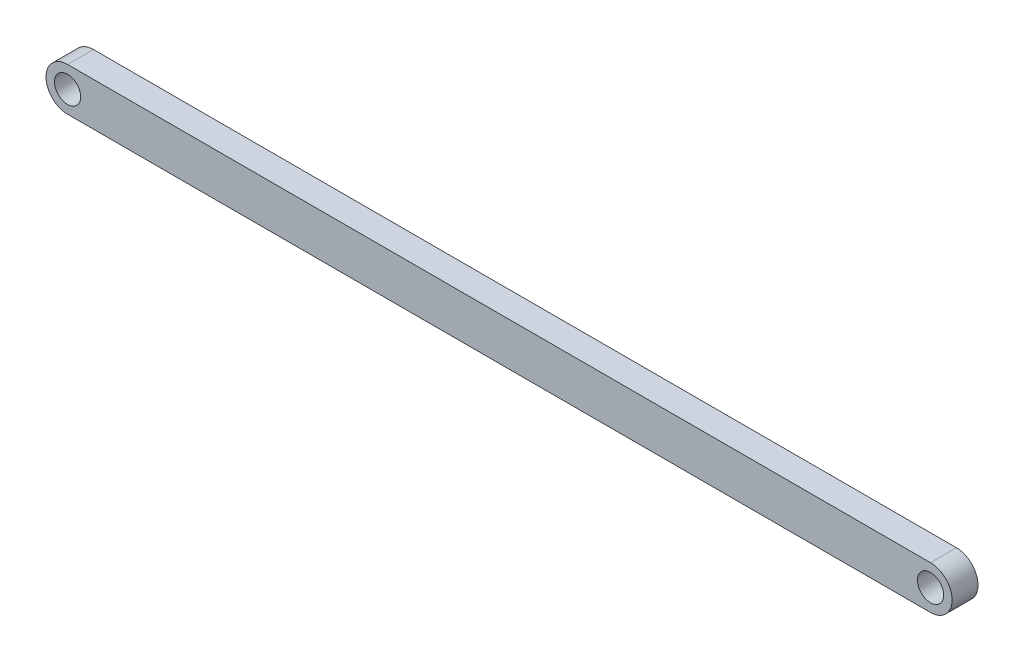
ISO-10303-21;
HEADER;
FILE_DESCRIPTION(('STEP AP214'),'2;1');
FILE_NAME('part.step','',(''),(''),'','','');
FILE_SCHEMA(('AUTOMOTIVE_DESIGN { 1 0 10303 214 1 1 1 1 }'));
ENDSEC;
DATA;
#1=APPLICATION_CONTEXT('core data for automotive mechanical design processes');
#2=APPLICATION_PROTOCOL_DEFINITION('international standard','automotive_design',2000,#1);
#3=PRODUCT_CONTEXT('',#1,'mechanical');
#4=PRODUCT('Part','Part','',(#3));
#5=PRODUCT_RELATED_PRODUCT_CATEGORY('part','',(#4));
#6=PRODUCT_DEFINITION_FORMATION('','',#4);
#7=PRODUCT_DEFINITION_CONTEXT('part definition',#1,'design');
#8=PRODUCT_DEFINITION('design','',#6,#7);
#9=PRODUCT_DEFINITION_SHAPE('','',#8);
#10=(LENGTH_UNIT() NAMED_UNIT(*) SI_UNIT(.MILLI.,.METRE.));
#11=(NAMED_UNIT(*) PLANE_ANGLE_UNIT() SI_UNIT($,.RADIAN.));
#12=(NAMED_UNIT(*) SI_UNIT($,.STERADIAN.) SOLID_ANGLE_UNIT());
#13=UNCERTAINTY_MEASURE_WITH_UNIT(LENGTH_MEASURE(1.E-05),#10,'distance_accuracy_value','');
#14=(GEOMETRIC_REPRESENTATION_CONTEXT(3) GLOBAL_UNCERTAINTY_ASSIGNED_CONTEXT((#13)) GLOBAL_UNIT_ASSIGNED_CONTEXT((#10,
#11,#12)) REPRESENTATION_CONTEXT('',''));
#15=CARTESIAN_POINT('',(0.,0.,0.));
#16=DIRECTION('',(0.,0.,1.));
#17=DIRECTION('',(1.,0.,0.));
#18=AXIS2_PLACEMENT_3D('',#15,#16,#17);
#19=CARTESIAN_POINT('',(-76.2061243654822,0.,15.));
#20=DIRECTION('',(0.,0.,1.));
#21=DIRECTION('',(1.,0.,0.));
#22=AXIS2_PLACEMENT_3D('',#19,#20,#21);
#23=PLANE('',#22);
#24=CARTESIAN_POINT('',(-76.2061243654822,0.,15.));
#25=DIRECTION('',(0.,0.,1.));
#26=DIRECTION('',(1.,0.,0.));
#27=AXIS2_PLACEMENT_3D('',#24,#25,#26);
#28=CIRCLE('',#27,7.59999999999999);
#29=CARTESIAN_POINT('',(-68.6061243654822,0.,15.));
#30=VERTEX_POINT('',#29);
#31=EDGE_CURVE('E100',#30,#30,#28,.T.);
#32=ORIENTED_EDGE('',*,*,#31,.F.);
#33=EDGE_LOOP('',(#32));
#34=FACE_BOUND('',#33,.T.);
#35=CARTESIAN_POINT('',(-76.2061243654822,0.,15.));
#36=DIRECTION('',(0.,0.,1.));
#37=DIRECTION('',(1.,0.,0.));
#38=AXIS2_PLACEMENT_3D('',#35,#36,#37);
#39=CIRCLE('',#38,12.5);
#40=CARTESIAN_POINT('',(-76.2061243654822,12.5,15.));
#41=VERTEX_POINT('',#40);
#42=CARTESIAN_POINT('',(-76.2061243654822,-12.5,15.));
#43=VERTEX_POINT('',#42);
#44=EDGE_CURVE('E85',#41,#43,#39,.T.);
#45=ORIENTED_EDGE('',*,*,#44,.T.);
#46=DIRECTION('',(1.,0.,0.));
#47=VECTOR('',#46,1.);
#48=CARTESIAN_POINT('',(-76.2061243654822,-12.5,15.));
#49=LINE('',#48,#47);
#50=CARTESIAN_POINT('',(423.793875634518,-12.5,15.));
#51=VERTEX_POINT('',#50);
#52=EDGE_CURVE('E80',#43,#51,#49,.T.);
#53=ORIENTED_EDGE('',*,*,#52,.T.);
#54=CARTESIAN_POINT('',(423.793875634518,0.,15.));
#55=DIRECTION('',(0.,0.,1.));
#56=DIRECTION('',(1.,0.,0.));
#57=AXIS2_PLACEMENT_3D('',#54,#55,#56);
#58=CIRCLE('',#57,12.5);
#59=CARTESIAN_POINT('',(423.793875634518,12.5,15.));
#60=VERTEX_POINT('',#59);
#61=EDGE_CURVE('E83',#51,#60,#58,.T.);
#62=ORIENTED_EDGE('',*,*,#61,.T.);
#63=DIRECTION('',(-1.,0.,0.));
#64=VECTOR('',#63,1.);
#65=CARTESIAN_POINT('',(-76.2061243654822,12.5,15.));
#66=LINE('',#65,#64);
#67=EDGE_CURVE('E50',#60,#41,#66,.T.);
#68=ORIENTED_EDGE('',*,*,#67,.T.);
#69=EDGE_LOOP('',(#45,#53,#62,#68));
#70=FACE_BOUND('',#69,.T.);
#71=CARTESIAN_POINT('',(423.793875634518,0.,15.));
#72=DIRECTION('',(0.,0.,1.));
#73=DIRECTION('',(1.,0.,0.));
#74=AXIS2_PLACEMENT_3D('',#71,#72,#73);
#75=CIRCLE('',#74,7.60000000000001);
#76=CARTESIAN_POINT('',(431.393875634518,0.,15.));
#77=VERTEX_POINT('',#76);
#78=EDGE_CURVE('E115',#77,#77,#75,.T.);
#79=ORIENTED_EDGE('',*,*,#78,.F.);
#80=EDGE_LOOP('',(#79));
#81=FACE_BOUND('',#80,.T.);
#82=ADVANCED_FACE('F33',(#34,#70,#81),#23,.T.);
#83=CARTESIAN_POINT('',(-76.2061243654822,0.,0.));
#84=DIRECTION('',(0.,0.,1.));
#85=DIRECTION('',(1.,0.,0.));
#86=AXIS2_PLACEMENT_3D('',#83,#84,#85);
#87=PLANE('',#86);
#88=CARTESIAN_POINT('',(-76.2061243654822,0.,0.));
#89=DIRECTION('',(0.,0.,1.));
#90=DIRECTION('',(1.,0.,0.));
#91=AXIS2_PLACEMENT_3D('',#88,#89,#90);
#92=CIRCLE('',#91,7.59999999999999);
#93=CARTESIAN_POINT('',(-68.6061243654822,0.,0.));
#94=VERTEX_POINT('',#93);
#95=EDGE_CURVE('E112',#94,#94,#92,.T.);
#96=ORIENTED_EDGE('',*,*,#95,.T.);
#97=EDGE_LOOP('',(#96));
#98=FACE_BOUND('',#97,.T.);
#99=CARTESIAN_POINT('',(-76.2061243654822,0.,0.));
#100=DIRECTION('',(0.,0.,1.));
#101=DIRECTION('',(1.,0.,0.));
#102=AXIS2_PLACEMENT_3D('',#99,#100,#101);
#103=CIRCLE('',#102,12.5);
#104=CARTESIAN_POINT('',(-76.2061243654822,12.5,0.));
#105=VERTEX_POINT('',#104);
#106=CARTESIAN_POINT('',(-76.2061243654822,-12.5,0.));
#107=VERTEX_POINT('',#106);
#108=EDGE_CURVE('E97',#105,#107,#103,.T.);
#109=ORIENTED_EDGE('',*,*,#108,.F.);
#110=DIRECTION('',(-1.,0.,0.));
#111=VECTOR('',#110,1.);
#112=CARTESIAN_POINT('',(-76.2061243654822,12.5,0.));
#113=LINE('',#112,#111);
#114=CARTESIAN_POINT('',(423.793875634518,12.5,0.));
#115=VERTEX_POINT('',#114);
#116=EDGE_CURVE('E73',#115,#105,#113,.T.);
#117=ORIENTED_EDGE('',*,*,#116,.F.);
#118=CARTESIAN_POINT('',(423.793875634518,0.,0.));
#119=DIRECTION('',(0.,0.,1.));
#120=DIRECTION('',(1.,0.,0.));
#121=AXIS2_PLACEMENT_3D('',#118,#119,#120);
#122=CIRCLE('',#121,12.5);
#123=CARTESIAN_POINT('',(423.793875634518,-12.5,0.));
#124=VERTEX_POINT('',#123);
#125=EDGE_CURVE('E67',#124,#115,#122,.T.);
#126=ORIENTED_EDGE('',*,*,#125,.F.);
#127=DIRECTION('',(1.,0.,0.));
#128=VECTOR('',#127,1.);
#129=CARTESIAN_POINT('',(-76.2061243654822,-12.5,0.));
#130=LINE('',#129,#128);
#131=EDGE_CURVE('E89',#107,#124,#130,.T.);
#132=ORIENTED_EDGE('',*,*,#131,.F.);
#133=EDGE_LOOP('',(#109,#117,#126,#132));
#134=FACE_BOUND('',#133,.T.);
#135=CARTESIAN_POINT('',(423.793875634518,0.,0.));
#136=DIRECTION('',(0.,0.,1.));
#137=DIRECTION('',(1.,0.,0.));
#138=AXIS2_PLACEMENT_3D('',#135,#136,#137);
#139=CIRCLE('',#138,7.60000000000001);
#140=CARTESIAN_POINT('',(431.393875634518,0.,0.));
#141=VERTEX_POINT('',#140);
#142=EDGE_CURVE('E118',#141,#141,#139,.T.);
#143=ORIENTED_EDGE('',*,*,#142,.T.);
#144=EDGE_LOOP('',(#143));
#145=FACE_BOUND('',#144,.T.);
#146=ADVANCED_FACE('F108',(#98,#134,#145),#87,.F.);
#147=CARTESIAN_POINT('',(-76.2061243654822,0.,15.));
#148=DIRECTION('',(0.,0.,-1.));
#149=DIRECTION('',(-1.,0.,0.));
#150=AXIS2_PLACEMENT_3D('',#147,#148,#149);
#151=CYLINDRICAL_SURFACE('',#150,12.5);
#152=ORIENTED_EDGE('',*,*,#108,.T.);
#153=DIRECTION('',(0.,0.,-1.));
#154=VECTOR('',#153,1.);
#155=CARTESIAN_POINT('',(-76.2061243654822,-12.5,15.));
#156=LINE('',#155,#154);
#157=EDGE_CURVE('E11',#43,#107,#156,.T.);
#158=ORIENTED_EDGE('',*,*,#157,.F.);
#159=ORIENTED_EDGE('',*,*,#44,.F.);
#160=DIRECTION('',(0.,0.,-1.));
#161=VECTOR('',#160,1.);
#162=CARTESIAN_POINT('',(-76.2061243654822,12.5,15.));
#163=LINE('',#162,#161);
#164=EDGE_CURVE('E93',#41,#105,#163,.T.);
#165=ORIENTED_EDGE('',*,*,#164,.T.);
#166=EDGE_LOOP('',(#152,#158,#159,#165));
#167=FACE_BOUND('',#166,.T.);
#168=ADVANCED_FACE('F35',(#167),#151,.T.);
#169=CARTESIAN_POINT('',(-76.2061243654822,-12.5,15.));
#170=DIRECTION('',(0.,1.,0.));
#171=DIRECTION('',(-1.,0.,0.));
#172=AXIS2_PLACEMENT_3D('',#169,#170,#171);
#173=PLANE('',#172);
#174=ORIENTED_EDGE('',*,*,#131,.T.);
#175=DIRECTION('',(0.,0.,-1.));
#176=VECTOR('',#175,1.);
#177=CARTESIAN_POINT('',(423.793875634518,-12.5,15.));
#178=LINE('',#177,#176);
#179=EDGE_CURVE('E42',#51,#124,#178,.T.);
#180=ORIENTED_EDGE('',*,*,#179,.F.);
#181=ORIENTED_EDGE('',*,*,#52,.F.);
#182=ORIENTED_EDGE('',*,*,#157,.T.);
#183=EDGE_LOOP('',(#174,#180,#181,#182));
#184=FACE_BOUND('',#183,.T.);
#185=ADVANCED_FACE('F88',(#184),#173,.F.);
#186=CARTESIAN_POINT('',(423.793875634518,0.,15.));
#187=DIRECTION('',(0.,0.,-1.));
#188=DIRECTION('',(-1.,0.,0.));
#189=AXIS2_PLACEMENT_3D('',#186,#187,#188);
#190=CYLINDRICAL_SURFACE('',#189,12.5);
#191=ORIENTED_EDGE('',*,*,#125,.T.);
#192=DIRECTION('',(0.,0.,-1.));
#193=VECTOR('',#192,1.);
#194=CARTESIAN_POINT('',(423.793875634518,12.5,15.));
#195=LINE('',#194,#193);
#196=EDGE_CURVE('E90',#60,#115,#195,.T.);
#197=ORIENTED_EDGE('',*,*,#196,.F.);
#198=ORIENTED_EDGE('',*,*,#61,.F.);
#199=ORIENTED_EDGE('',*,*,#179,.T.);
#200=EDGE_LOOP('',(#191,#197,#198,#199));
#201=FACE_BOUND('',#200,.T.);
#202=ADVANCED_FACE('F91',(#201),#190,.T.);
#203=CARTESIAN_POINT('',(-76.2061243654822,12.5,15.));
#204=DIRECTION('',(0.,-1.,0.));
#205=DIRECTION('',(1.,0.,0.));
#206=AXIS2_PLACEMENT_3D('',#203,#204,#205);
#207=PLANE('',#206);
#208=ORIENTED_EDGE('',*,*,#116,.T.);
#209=ORIENTED_EDGE('',*,*,#164,.F.);
#210=ORIENTED_EDGE('',*,*,#67,.F.);
#211=ORIENTED_EDGE('',*,*,#196,.T.);
#212=EDGE_LOOP('',(#208,#209,#210,#211));
#213=FACE_BOUND('',#212,.T.);
#214=ADVANCED_FACE('F105',(#213),#207,.F.);
#215=CARTESIAN_POINT('',(-76.2061243654822,0.,15.));
#216=DIRECTION('',(0.,0.,-1.));
#217=DIRECTION('',(-1.,0.,0.));
#218=AXIS2_PLACEMENT_3D('',#215,#216,#217);
#219=CYLINDRICAL_SURFACE('',#218,7.59999999999999);
#220=ORIENTED_EDGE('',*,*,#31,.T.);
#221=EDGE_LOOP('',(#220));
#222=FACE_BOUND('',#221,.T.);
#223=ORIENTED_EDGE('',*,*,#95,.F.);
#224=EDGE_LOOP('',(#223));
#225=FACE_BOUND('',#224,.T.);
#226=ADVANCED_FACE('F136',(#222,#225),#219,.F.);
#227=CARTESIAN_POINT('',(423.793875634518,0.,15.));
#228=DIRECTION('',(0.,0.,-1.));
#229=DIRECTION('',(-1.,0.,0.));
#230=AXIS2_PLACEMENT_3D('',#227,#228,#229);
#231=CYLINDRICAL_SURFACE('',#230,7.60000000000001);
#232=ORIENTED_EDGE('',*,*,#78,.T.);
#233=EDGE_LOOP('',(#232));
#234=FACE_BOUND('',#233,.T.);
#235=ORIENTED_EDGE('',*,*,#142,.F.);
#236=EDGE_LOOP('',(#235));
#237=FACE_BOUND('',#236,.T.);
#238=ADVANCED_FACE('F124',(#234,#237),#231,.F.);
#239=CLOSED_SHELL('',(#82,#146,#168,#185,#202,#214,#226,#238));
#240=MANIFOLD_SOLID_BREP('B2',#239);
#241=ADVANCED_BREP_SHAPE_REPRESENTATION('',(#18,#240),#14);
#242=SHAPE_DEFINITION_REPRESENTATION(#9,#241);
ENDSEC;
END-ISO-10303-21;
